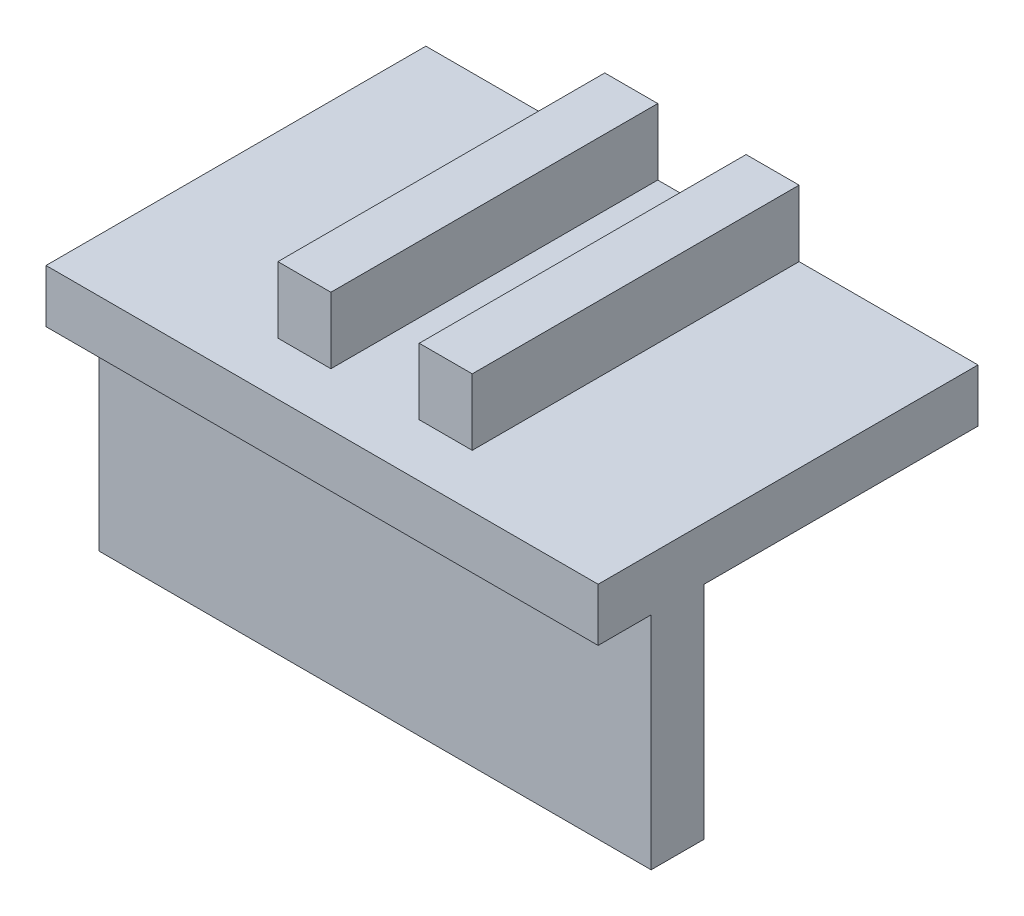
ISO-10303-21;
HEADER;
FILE_DESCRIPTION(('STEP AP214'),'2;1');
FILE_NAME('part.step','',(''),(''),'','','');
FILE_SCHEMA(('AUTOMOTIVE_DESIGN { 1 0 10303 214 1 1 1 1 }'));
ENDSEC;
DATA;
#1=APPLICATION_CONTEXT('core data for automotive mechanical design processes');
#2=APPLICATION_PROTOCOL_DEFINITION('international standard','automotive_design',2000,#1);
#3=PRODUCT_CONTEXT('',#1,'mechanical');
#4=PRODUCT('Part','Part','',(#3));
#5=PRODUCT_RELATED_PRODUCT_CATEGORY('part','',(#4));
#6=PRODUCT_DEFINITION_FORMATION('','',#4);
#7=PRODUCT_DEFINITION_CONTEXT('part definition',#1,'design');
#8=PRODUCT_DEFINITION('design','',#6,#7);
#9=PRODUCT_DEFINITION_SHAPE('','',#8);
#10=(LENGTH_UNIT() NAMED_UNIT(*) SI_UNIT(.MILLI.,.METRE.));
#11=(NAMED_UNIT(*) PLANE_ANGLE_UNIT() SI_UNIT($,.RADIAN.));
#12=(NAMED_UNIT(*) SI_UNIT($,.STERADIAN.) SOLID_ANGLE_UNIT());
#13=UNCERTAINTY_MEASURE_WITH_UNIT(LENGTH_MEASURE(1.E-05),#10,'distance_accuracy_value','');
#14=(GEOMETRIC_REPRESENTATION_CONTEXT(3) GLOBAL_UNCERTAINTY_ASSIGNED_CONTEXT((#13)) GLOBAL_UNIT_ASSIGNED_CONTEXT((#10,
#11,#12)) REPRESENTATION_CONTEXT('',''));
#15=CARTESIAN_POINT('',(0.,0.,0.));
#16=DIRECTION('',(0.,0.,1.));
#17=DIRECTION('',(1.,0.,0.));
#18=AXIS2_PLACEMENT_3D('',#15,#16,#17);
#19=CARTESIAN_POINT('',(0.,0.,12.));
#20=DIRECTION('',(0.,0.,-1.));
#21=DIRECTION('',(-1.,0.,0.));
#22=AXIS2_PLACEMENT_3D('',#19,#20,#21);
#23=PLANE('',#22);
#24=DIRECTION('',(-1.,0.,0.));
#25=VECTOR('',#24,1.);
#26=CARTESIAN_POINT('',(125.,62.,12.));
#27=LINE('',#26,#25);
#28=CARTESIAN_POINT('',(84.5,62.,12.));
#29=VERTEX_POINT('',#28);
#30=CARTESIAN_POINT('',(72.5,62.,12.));
#31=VERTEX_POINT('',#30);
#32=EDGE_CURVE('E11',#29,#31,#27,.T.);
#33=ORIENTED_EDGE('',*,*,#32,.F.);
#34=DIRECTION('',(0.,-1.,0.));
#35=VECTOR('',#34,1.);
#36=CARTESIAN_POINT('',(84.5,77.,12.));
#37=LINE('',#36,#35);
#38=CARTESIAN_POINT('',(84.5,77.,12.));
#39=VERTEX_POINT('',#38);
#40=EDGE_CURVE('E182',#39,#29,#37,.T.);
#41=ORIENTED_EDGE('',*,*,#40,.F.);
#42=DIRECTION('',(1.,0.,0.));
#43=VECTOR('',#42,1.);
#44=CARTESIAN_POINT('',(72.5,77.,12.));
#45=LINE('',#44,#43);
#46=CARTESIAN_POINT('',(72.5,77.,12.));
#47=VERTEX_POINT('',#46);
#48=EDGE_CURVE('E204',#47,#39,#45,.T.);
#49=ORIENTED_EDGE('',*,*,#48,.F.);
#50=DIRECTION('',(0.,-1.,0.));
#51=VECTOR('',#50,1.);
#52=CARTESIAN_POINT('',(72.5,77.,12.));
#53=LINE('',#52,#51);
#54=EDGE_CURVE('E57',#47,#31,#53,.T.);
#55=ORIENTED_EDGE('',*,*,#54,.T.);
#56=EDGE_LOOP('',(#33,#41,#49,#55));
#57=FACE_BOUND('',#56,.T.);
#58=ADVANCED_FACE('F32',(#57),#23,.F.);
#59=CARTESIAN_POINT('',(52.5,62.,12.));
#60=VERTEX_POINT('',#59);
#61=CARTESIAN_POINT('',(40.5,62.,12.));
#62=VERTEX_POINT('',#61);
#63=EDGE_CURVE('E41',#60,#62,#27,.T.);
#64=ORIENTED_EDGE('',*,*,#63,.F.);
#65=DIRECTION('',(0.,-1.,0.));
#66=VECTOR('',#65,1.);
#67=CARTESIAN_POINT('',(52.5,77.,12.));
#68=LINE('',#67,#66);
#69=CARTESIAN_POINT('',(52.5,77.,12.));
#70=VERTEX_POINT('',#69);
#71=EDGE_CURVE('E229',#70,#60,#68,.T.);
#72=ORIENTED_EDGE('',*,*,#71,.F.);
#73=DIRECTION('',(1.,0.,0.));
#74=VECTOR('',#73,1.);
#75=CARTESIAN_POINT('',(40.5,77.,12.));
#76=LINE('',#75,#74);
#77=CARTESIAN_POINT('',(40.5,77.,12.));
#78=VERTEX_POINT('',#77);
#79=EDGE_CURVE('E211',#78,#70,#76,.T.);
#80=ORIENTED_EDGE('',*,*,#79,.F.);
#81=DIRECTION('',(0.,-1.,0.));
#82=VECTOR('',#81,1.);
#83=CARTESIAN_POINT('',(40.5,77.,12.));
#84=LINE('',#83,#82);
#85=EDGE_CURVE('E232',#78,#62,#84,.T.);
#86=ORIENTED_EDGE('',*,*,#85,.T.);
#87=EDGE_LOOP('',(#64,#72,#80,#86));
#88=FACE_BOUND('',#87,.T.);
#89=ADVANCED_FACE('F280',(#88),#23,.F.);
#90=DIRECTION('',(1.,0.,0.));
#91=VECTOR('',#90,1.);
#92=CARTESIAN_POINT('',(0.,50.,12.));
#93=LINE('',#92,#91);
#94=CARTESIAN_POINT('',(0.,50.,12.));
#95=VERTEX_POINT('',#94);
#96=CARTESIAN_POINT('',(125.,50.,12.));
#97=VERTEX_POINT('',#96);
#98=EDGE_CURVE('E49',#95,#97,#93,.T.);
#99=ORIENTED_EDGE('',*,*,#98,.F.);
#100=DIRECTION('',(0.,-1.,0.));
#101=VECTOR('',#100,1.);
#102=CARTESIAN_POINT('',(0.,0.,12.));
#103=LINE('',#102,#101);
#104=CARTESIAN_POINT('',(0.,0.,12.));
#105=VERTEX_POINT('',#104);
#106=EDGE_CURVE('E255',#95,#105,#103,.T.);
#107=ORIENTED_EDGE('',*,*,#106,.T.);
#108=DIRECTION('',(1.,0.,0.));
#109=VECTOR('',#108,1.);
#110=CARTESIAN_POINT('',(0.,0.,12.));
#111=LINE('',#110,#109);
#112=CARTESIAN_POINT('',(125.,0.,12.));
#113=VERTEX_POINT('',#112);
#114=EDGE_CURVE('E257',#105,#113,#111,.T.);
#115=ORIENTED_EDGE('',*,*,#114,.T.);
#116=DIRECTION('',(0.,1.,0.));
#117=VECTOR('',#116,1.);
#118=CARTESIAN_POINT('',(125.,0.,12.));
#119=LINE('',#118,#117);
#120=EDGE_CURVE('E158',#113,#97,#119,.T.);
#121=ORIENTED_EDGE('',*,*,#120,.T.);
#122=EDGE_LOOP('',(#99,#107,#115,#121));
#123=FACE_BOUND('',#122,.T.);
#124=ADVANCED_FACE('F307',(#123),#23,.F.);
#125=CARTESIAN_POINT('',(0.,0.,0.));
#126=DIRECTION('',(0.,0.,-1.));
#127=DIRECTION('',(-1.,0.,0.));
#128=AXIS2_PLACEMENT_3D('',#125,#126,#127);
#129=PLANE('',#128);
#130=DIRECTION('',(0.,-1.,0.));
#131=VECTOR('',#130,1.);
#132=CARTESIAN_POINT('',(0.,0.,0.));
#133=LINE('',#132,#131);
#134=CARTESIAN_POINT('',(0.,50.,0.));
#135=VERTEX_POINT('',#134);
#136=CARTESIAN_POINT('',(0.,0.,0.));
#137=VERTEX_POINT('',#136);
#138=EDGE_CURVE('E252',#135,#137,#133,.T.);
#139=ORIENTED_EDGE('',*,*,#138,.F.);
#140=DIRECTION('',(1.,0.,0.));
#141=VECTOR('',#140,1.);
#142=CARTESIAN_POINT('',(0.,50.,0.));
#143=LINE('',#142,#141);
#144=CARTESIAN_POINT('',(125.,50.,0.));
#145=VERTEX_POINT('',#144);
#146=EDGE_CURVE('E237',#135,#145,#143,.T.);
#147=ORIENTED_EDGE('',*,*,#146,.T.);
#148=DIRECTION('',(0.,1.,0.));
#149=VECTOR('',#148,1.);
#150=CARTESIAN_POINT('',(125.,0.,0.));
#151=LINE('',#150,#149);
#152=CARTESIAN_POINT('',(125.,0.,0.));
#153=VERTEX_POINT('',#152);
#154=EDGE_CURVE('E258',#153,#145,#151,.T.);
#155=ORIENTED_EDGE('',*,*,#154,.F.);
#156=DIRECTION('',(1.,0.,0.));
#157=VECTOR('',#156,1.);
#158=CARTESIAN_POINT('',(0.,0.,0.));
#159=LINE('',#158,#157);
#160=EDGE_CURVE('E262',#137,#153,#159,.T.);
#161=ORIENTED_EDGE('',*,*,#160,.F.);
#162=EDGE_LOOP('',(#139,#147,#155,#161));
#163=FACE_BOUND('',#162,.T.);
#164=ADVANCED_FACE('F314',(#163),#129,.T.);
#165=CARTESIAN_POINT('',(0.,0.,12.));
#166=DIRECTION('',(1.,0.,0.));
#167=DIRECTION('',(0.,0.,-1.));
#168=AXIS2_PLACEMENT_3D('',#165,#166,#167);
#169=PLANE('',#168);
#170=DIRECTION('',(0.,0.,-1.));
#171=VECTOR('',#170,1.);
#172=CARTESIAN_POINT('',(0.,62.,12.));
#173=LINE('',#172,#171);
#174=CARTESIAN_POINT('',(0.,62.,24.));
#175=VERTEX_POINT('',#174);
#176=CARTESIAN_POINT('',(0.,62.,-62.));
#177=VERTEX_POINT('',#176);
#178=EDGE_CURVE('E147',#175,#177,#173,.T.);
#179=ORIENTED_EDGE('',*,*,#178,.T.);
#180=DIRECTION('',(0.,1.,0.));
#181=VECTOR('',#180,1.);
#182=CARTESIAN_POINT('',(0.,50.,-62.));
#183=LINE('',#182,#181);
#184=CARTESIAN_POINT('',(0.,50.,-62.));
#185=VERTEX_POINT('',#184);
#186=EDGE_CURVE('E250',#185,#177,#183,.T.);
#187=ORIENTED_EDGE('',*,*,#186,.F.);
#188=DIRECTION('',(0.,0.,1.));
#189=VECTOR('',#188,1.);
#190=CARTESIAN_POINT('',(0.,50.,0.));
#191=LINE('',#190,#189);
#192=EDGE_CURVE('E234',#185,#135,#191,.T.);
#193=ORIENTED_EDGE('',*,*,#192,.T.);
#194=ORIENTED_EDGE('',*,*,#138,.T.);
#195=DIRECTION('',(0.,0.,-1.));
#196=VECTOR('',#195,1.);
#197=CARTESIAN_POINT('',(0.,0.,12.));
#198=LINE('',#197,#196);
#199=EDGE_CURVE('E36',#105,#137,#198,.T.);
#200=ORIENTED_EDGE('',*,*,#199,.F.);
#201=ORIENTED_EDGE('',*,*,#106,.F.);
#202=DIRECTION('',(0.,0.,-1.));
#203=VECTOR('',#202,1.);
#204=CARTESIAN_POINT('',(0.,50.,24.));
#205=LINE('',#204,#203);
#206=CARTESIAN_POINT('',(0.,50.,24.));
#207=VERTEX_POINT('',#206);
#208=EDGE_CURVE('E163',#207,#95,#205,.T.);
#209=ORIENTED_EDGE('',*,*,#208,.F.);
#210=DIRECTION('',(0.,-1.,0.));
#211=VECTOR('',#210,1.);
#212=CARTESIAN_POINT('',(0.,62.,24.));
#213=LINE('',#212,#211);
#214=EDGE_CURVE('E161',#175,#207,#213,.T.);
#215=ORIENTED_EDGE('',*,*,#214,.F.);
#216=EDGE_LOOP('',(#179,#187,#193,#194,#200,#201,#209,#215));
#217=FACE_BOUND('',#216,.T.);
#218=ADVANCED_FACE('F34',(#217),#169,.F.);
#219=CARTESIAN_POINT('',(0.,0.,12.));
#220=DIRECTION('',(0.,1.,0.));
#221=DIRECTION('',(0.,0.,1.));
#222=AXIS2_PLACEMENT_3D('',#219,#220,#221);
#223=PLANE('',#222);
#224=ORIENTED_EDGE('',*,*,#160,.T.);
#225=DIRECTION('',(0.,0.,-1.));
#226=VECTOR('',#225,1.);
#227=CARTESIAN_POINT('',(125.,0.,12.));
#228=LINE('',#227,#226);
#229=EDGE_CURVE('E266',#113,#153,#228,.T.);
#230=ORIENTED_EDGE('',*,*,#229,.F.);
#231=ORIENTED_EDGE('',*,*,#114,.F.);
#232=ORIENTED_EDGE('',*,*,#199,.T.);
#233=EDGE_LOOP('',(#224,#230,#231,#232));
#234=FACE_BOUND('',#233,.T.);
#235=ADVANCED_FACE('F323',(#234),#223,.F.);
#236=CARTESIAN_POINT('',(125.,0.,12.));
#237=DIRECTION('',(-1.,0.,0.));
#238=DIRECTION('',(0.,0.,1.));
#239=AXIS2_PLACEMENT_3D('',#236,#237,#238);
#240=PLANE('',#239);
#241=ORIENTED_EDGE('',*,*,#154,.T.);
#242=DIRECTION('',(0.,0.,-1.));
#243=VECTOR('',#242,1.);
#244=CARTESIAN_POINT('',(125.,50.,0.));
#245=LINE('',#244,#243);
#246=CARTESIAN_POINT('',(125.,50.,-62.));
#247=VERTEX_POINT('',#246);
#248=EDGE_CURVE('E241',#145,#247,#245,.T.);
#249=ORIENTED_EDGE('',*,*,#248,.T.);
#250=DIRECTION('',(0.,1.,0.));
#251=VECTOR('',#250,1.);
#252=CARTESIAN_POINT('',(125.,50.,-62.));
#253=LINE('',#252,#251);
#254=CARTESIAN_POINT('',(125.,62.,-62.));
#255=VERTEX_POINT('',#254);
#256=EDGE_CURVE('E247',#247,#255,#253,.T.);
#257=ORIENTED_EDGE('',*,*,#256,.T.);
#258=DIRECTION('',(0.,0.,-1.));
#259=VECTOR('',#258,1.);
#260=CARTESIAN_POINT('',(125.,62.,12.));
#261=LINE('',#260,#259);
#262=CARTESIAN_POINT('',(125.,62.,24.));
#263=VERTEX_POINT('',#262);
#264=EDGE_CURVE('E157',#263,#255,#261,.T.);
#265=ORIENTED_EDGE('',*,*,#264,.F.);
#266=DIRECTION('',(0.,1.,0.));
#267=VECTOR('',#266,1.);
#268=CARTESIAN_POINT('',(125.,50.,24.));
#269=LINE('',#268,#267);
#270=CARTESIAN_POINT('',(125.,50.,24.));
#271=VERTEX_POINT('',#270);
#272=EDGE_CURVE('E171',#271,#263,#269,.T.);
#273=ORIENTED_EDGE('',*,*,#272,.F.);
#274=DIRECTION('',(0.,0.,-1.));
#275=VECTOR('',#274,1.);
#276=CARTESIAN_POINT('',(125.,50.,24.));
#277=LINE('',#276,#275);
#278=EDGE_CURVE('E176',#271,#97,#277,.T.);
#279=ORIENTED_EDGE('',*,*,#278,.T.);
#280=ORIENTED_EDGE('',*,*,#120,.F.);
#281=ORIENTED_EDGE('',*,*,#229,.T.);
#282=EDGE_LOOP('',(#241,#249,#257,#265,#273,#279,#280,#281));
#283=FACE_BOUND('',#282,.T.);
#284=ADVANCED_FACE('F328',(#283),#240,.F.);
#285=CARTESIAN_POINT('',(0.,62.,12.));
#286=DIRECTION('',(0.,-1.,0.));
#287=DIRECTION('',(0.,0.,-1.));
#288=AXIS2_PLACEMENT_3D('',#285,#286,#287);
#289=PLANE('',#288);
#290=DIRECTION('',(-1.,0.,0.));
#291=VECTOR('',#290,1.);
#292=CARTESIAN_POINT('',(0.,62.,-62.));
#293=LINE('',#292,#291);
#294=CARTESIAN_POINT('',(84.5,62.,-62.));
#295=VERTEX_POINT('',#294);
#296=EDGE_CURVE('E238',#255,#295,#293,.T.);
#297=ORIENTED_EDGE('',*,*,#296,.T.);
#298=DIRECTION('',(0.,0.,1.));
#299=VECTOR('',#298,1.);
#300=CARTESIAN_POINT('',(84.5,62.,-62.));
#301=LINE('',#300,#299);
#302=EDGE_CURVE('E192',#295,#29,#301,.T.);
#303=ORIENTED_EDGE('',*,*,#302,.T.);
#304=ORIENTED_EDGE('',*,*,#32,.T.);
#305=DIRECTION('',(0.,0.,1.));
#306=VECTOR('',#305,1.);
#307=CARTESIAN_POINT('',(72.5,62.,-62.));
#308=LINE('',#307,#306);
#309=CARTESIAN_POINT('',(72.5,62.,-62.));
#310=VERTEX_POINT('',#309);
#311=EDGE_CURVE('E195',#310,#31,#308,.T.);
#312=ORIENTED_EDGE('',*,*,#311,.F.);
#313=CARTESIAN_POINT('',(52.5,62.,-62.));
#314=VERTEX_POINT('',#313);
#315=EDGE_CURVE('E249',#310,#314,#293,.T.);
#316=ORIENTED_EDGE('',*,*,#315,.T.);
#317=DIRECTION('',(0.,0.,1.));
#318=VECTOR('',#317,1.);
#319=CARTESIAN_POINT('',(52.5,62.,-62.));
#320=LINE('',#319,#318);
#321=EDGE_CURVE('E212',#314,#60,#320,.T.);
#322=ORIENTED_EDGE('',*,*,#321,.T.);
#323=ORIENTED_EDGE('',*,*,#63,.T.);
#324=DIRECTION('',(0.,0.,1.));
#325=VECTOR('',#324,1.);
#326=CARTESIAN_POINT('',(40.5,62.,-62.));
#327=LINE('',#326,#325);
#328=CARTESIAN_POINT('',(40.5,62.,-62.));
#329=VERTEX_POINT('',#328);
#330=EDGE_CURVE('E198',#329,#62,#327,.T.);
#331=ORIENTED_EDGE('',*,*,#330,.F.);
#332=EDGE_CURVE('E154',#329,#177,#293,.T.);
#333=ORIENTED_EDGE('',*,*,#332,.T.);
#334=ORIENTED_EDGE('',*,*,#178,.F.);
#335=DIRECTION('',(-1.,0.,0.));
#336=VECTOR('',#335,1.);
#337=CARTESIAN_POINT('',(125.,62.,24.));
#338=LINE('',#337,#336);
#339=EDGE_CURVE('E151',#263,#175,#338,.T.);
#340=ORIENTED_EDGE('',*,*,#339,.F.);
#341=ORIENTED_EDGE('',*,*,#264,.T.);
#342=EDGE_LOOP('',(#297,#303,#304,#312,#316,#322,#323,#331,#333,#334,#340,#341));
#343=FACE_BOUND('',#342,.T.);
#344=ADVANCED_FACE('F149',(#343),#289,.F.);
#345=CARTESIAN_POINT('',(0.,50.,-62.));
#346=DIRECTION('',(0.,0.,-1.));
#347=DIRECTION('',(-1.,0.,0.));
#348=AXIS2_PLACEMENT_3D('',#345,#346,#347);
#349=PLANE('',#348);
#350=ORIENTED_EDGE('',*,*,#296,.F.);
#351=ORIENTED_EDGE('',*,*,#256,.F.);
#352=DIRECTION('',(-1.,0.,0.));
#353=VECTOR('',#352,1.);
#354=CARTESIAN_POINT('',(0.,50.,-62.));
#355=LINE('',#354,#353);
#356=EDGE_CURVE('E244',#247,#185,#355,.T.);
#357=ORIENTED_EDGE('',*,*,#356,.T.);
#358=ORIENTED_EDGE('',*,*,#186,.T.);
#359=ORIENTED_EDGE('',*,*,#332,.F.);
#360=DIRECTION('',(0.,-1.,0.));
#361=VECTOR('',#360,1.);
#362=CARTESIAN_POINT('',(40.5,77.,-62.));
#363=LINE('',#362,#361);
#364=CARTESIAN_POINT('',(40.5,77.,-62.));
#365=VERTEX_POINT('',#364);
#366=EDGE_CURVE('E220',#365,#329,#363,.T.);
#367=ORIENTED_EDGE('',*,*,#366,.F.);
#368=DIRECTION('',(1.,0.,0.));
#369=VECTOR('',#368,1.);
#370=CARTESIAN_POINT('',(40.5,77.,-62.));
#371=LINE('',#370,#369);
#372=CARTESIAN_POINT('',(52.5,77.,-62.));
#373=VERTEX_POINT('',#372);
#374=EDGE_CURVE('E217',#365,#373,#371,.T.);
#375=ORIENTED_EDGE('',*,*,#374,.T.);
#376=DIRECTION('',(0.,-1.,0.));
#377=VECTOR('',#376,1.);
#378=CARTESIAN_POINT('',(52.5,77.,-62.));
#379=LINE('',#378,#377);
#380=EDGE_CURVE('E226',#373,#314,#379,.T.);
#381=ORIENTED_EDGE('',*,*,#380,.T.);
#382=ORIENTED_EDGE('',*,*,#315,.F.);
#383=DIRECTION('',(0.,-1.,0.));
#384=VECTOR('',#383,1.);
#385=CARTESIAN_POINT('',(72.5,77.,-62.));
#386=LINE('',#385,#384);
#387=CARTESIAN_POINT('',(72.5,77.,-62.));
#388=VERTEX_POINT('',#387);
#389=EDGE_CURVE('E188',#388,#310,#386,.T.);
#390=ORIENTED_EDGE('',*,*,#389,.F.);
#391=DIRECTION('',(1.,0.,0.));
#392=VECTOR('',#391,1.);
#393=CARTESIAN_POINT('',(72.5,77.,-62.));
#394=LINE('',#393,#392);
#395=CARTESIAN_POINT('',(84.5,77.,-62.));
#396=VERTEX_POINT('',#395);
#397=EDGE_CURVE('E191',#388,#396,#394,.T.);
#398=ORIENTED_EDGE('',*,*,#397,.T.);
#399=DIRECTION('',(0.,-1.,0.));
#400=VECTOR('',#399,1.);
#401=CARTESIAN_POINT('',(84.5,77.,-62.));
#402=LINE('',#401,#400);
#403=EDGE_CURVE('E185',#396,#295,#402,.T.);
#404=ORIENTED_EDGE('',*,*,#403,.T.);
#405=EDGE_LOOP('',(#350,#351,#357,#358,#359,#367,#375,#381,#382,#390,#398,#404));
#406=FACE_BOUND('',#405,.T.);
#407=ADVANCED_FACE('F290',(#406),#349,.T.);
#408=CARTESIAN_POINT('',(0.,50.,0.));
#409=DIRECTION('',(0.,-1.,0.));
#410=DIRECTION('',(0.,0.,-1.));
#411=AXIS2_PLACEMENT_3D('',#408,#409,#410);
#412=PLANE('',#411);
#413=ORIENTED_EDGE('',*,*,#192,.F.);
#414=ORIENTED_EDGE('',*,*,#356,.F.);
#415=ORIENTED_EDGE('',*,*,#248,.F.);
#416=ORIENTED_EDGE('',*,*,#146,.F.);
#417=EDGE_LOOP('',(#413,#414,#415,#416));
#418=FACE_BOUND('',#417,.T.);
#419=ADVANCED_FACE('F295',(#418),#412,.T.);
#420=CARTESIAN_POINT('',(40.5,77.,-62.));
#421=DIRECTION('',(1.,0.,0.));
#422=DIRECTION('',(0.,0.,-1.));
#423=AXIS2_PLACEMENT_3D('',#420,#421,#422);
#424=PLANE('',#423);
#425=ORIENTED_EDGE('',*,*,#330,.T.);
#426=ORIENTED_EDGE('',*,*,#85,.F.);
#427=DIRECTION('',(0.,0.,1.));
#428=VECTOR('',#427,1.);
#429=CARTESIAN_POINT('',(40.5,77.,-62.));
#430=LINE('',#429,#428);
#431=EDGE_CURVE('E208',#365,#78,#430,.T.);
#432=ORIENTED_EDGE('',*,*,#431,.F.);
#433=ORIENTED_EDGE('',*,*,#366,.T.);
#434=EDGE_LOOP('',(#425,#426,#432,#433));
#435=FACE_BOUND('',#434,.T.);
#436=ADVANCED_FACE('F293',(#435),#424,.F.);
#437=CARTESIAN_POINT('',(52.5,77.,-62.));
#438=DIRECTION('',(1.,0.,0.));
#439=DIRECTION('',(0.,0.,-1.));
#440=AXIS2_PLACEMENT_3D('',#437,#438,#439);
#441=PLANE('',#440);
#442=ORIENTED_EDGE('',*,*,#321,.F.);
#443=ORIENTED_EDGE('',*,*,#380,.F.);
#444=DIRECTION('',(0.,0.,1.));
#445=VECTOR('',#444,1.);
#446=CARTESIAN_POINT('',(52.5,77.,-62.));
#447=LINE('',#446,#445);
#448=EDGE_CURVE('E214',#373,#70,#447,.T.);
#449=ORIENTED_EDGE('',*,*,#448,.T.);
#450=ORIENTED_EDGE('',*,*,#71,.T.);
#451=EDGE_LOOP('',(#442,#443,#449,#450));
#452=FACE_BOUND('',#451,.T.);
#453=ADVANCED_FACE('F283',(#452),#441,.T.);
#454=CARTESIAN_POINT('',(0.,77.,0.));
#455=DIRECTION('',(0.,1.,0.));
#456=DIRECTION('',(0.,0.,1.));
#457=AXIS2_PLACEMENT_3D('',#454,#455,#456);
#458=PLANE('',#457);
#459=ORIENTED_EDGE('',*,*,#431,.T.);
#460=ORIENTED_EDGE('',*,*,#79,.T.);
#461=ORIENTED_EDGE('',*,*,#448,.F.);
#462=ORIENTED_EDGE('',*,*,#374,.F.);
#463=EDGE_LOOP('',(#459,#460,#461,#462));
#464=FACE_BOUND('',#463,.T.);
#465=ADVANCED_FACE('F287',(#464),#458,.T.);
#466=CARTESIAN_POINT('',(72.5,77.,-62.));
#467=DIRECTION('',(1.,0.,0.));
#468=DIRECTION('',(0.,0.,-1.));
#469=AXIS2_PLACEMENT_3D('',#466,#467,#468);
#470=PLANE('',#469);
#471=ORIENTED_EDGE('',*,*,#311,.T.);
#472=ORIENTED_EDGE('',*,*,#54,.F.);
#473=DIRECTION('',(0.,0.,1.));
#474=VECTOR('',#473,1.);
#475=CARTESIAN_POINT('',(72.5,77.,-62.));
#476=LINE('',#475,#474);
#477=EDGE_CURVE('E196',#388,#47,#476,.T.);
#478=ORIENTED_EDGE('',*,*,#477,.F.);
#479=ORIENTED_EDGE('',*,*,#389,.T.);
#480=EDGE_LOOP('',(#471,#472,#478,#479));
#481=FACE_BOUND('',#480,.T.);
#482=ADVANCED_FACE('F351',(#481),#470,.F.);
#483=CARTESIAN_POINT('',(84.5,77.,-62.));
#484=DIRECTION('',(1.,0.,0.));
#485=DIRECTION('',(0.,0.,-1.));
#486=AXIS2_PLACEMENT_3D('',#483,#484,#485);
#487=PLANE('',#486);
#488=ORIENTED_EDGE('',*,*,#302,.F.);
#489=ORIENTED_EDGE('',*,*,#403,.F.);
#490=DIRECTION('',(0.,0.,1.));
#491=VECTOR('',#490,1.);
#492=CARTESIAN_POINT('',(84.5,77.,-62.));
#493=LINE('',#492,#491);
#494=EDGE_CURVE('E201',#396,#39,#493,.T.);
#495=ORIENTED_EDGE('',*,*,#494,.T.);
#496=ORIENTED_EDGE('',*,*,#40,.T.);
#497=EDGE_LOOP('',(#488,#489,#495,#496));
#498=FACE_BOUND('',#497,.T.);
#499=ADVANCED_FACE('F347',(#498),#487,.T.);
#500=CARTESIAN_POINT('',(0.,77.,0.));
#501=DIRECTION('',(0.,1.,0.));
#502=DIRECTION('',(0.,0.,1.));
#503=AXIS2_PLACEMENT_3D('',#500,#501,#502);
#504=PLANE('',#503);
#505=ORIENTED_EDGE('',*,*,#477,.T.);
#506=ORIENTED_EDGE('',*,*,#48,.T.);
#507=ORIENTED_EDGE('',*,*,#494,.F.);
#508=ORIENTED_EDGE('',*,*,#397,.F.);
#509=EDGE_LOOP('',(#505,#506,#507,#508));
#510=FACE_BOUND('',#509,.T.);
#511=ADVANCED_FACE('F340',(#510),#504,.T.);
#512=CARTESIAN_POINT('',(0.,50.,24.));
#513=DIRECTION('',(0.,1.,0.));
#514=DIRECTION('',(0.,0.,1.));
#515=AXIS2_PLACEMENT_3D('',#512,#513,#514);
#516=PLANE('',#515);
#517=ORIENTED_EDGE('',*,*,#98,.T.);
#518=ORIENTED_EDGE('',*,*,#278,.F.);
#519=DIRECTION('',(1.,0.,0.));
#520=VECTOR('',#519,1.);
#521=CARTESIAN_POINT('',(0.,50.,24.));
#522=LINE('',#521,#520);
#523=EDGE_CURVE('E166',#207,#271,#522,.T.);
#524=ORIENTED_EDGE('',*,*,#523,.F.);
#525=ORIENTED_EDGE('',*,*,#208,.T.);
#526=EDGE_LOOP('',(#517,#518,#524,#525));
#527=FACE_BOUND('',#526,.T.);
#528=ADVANCED_FACE('F338',(#527),#516,.F.);
#529=CARTESIAN_POINT('',(0.,0.,24.));
#530=DIRECTION('',(0.,0.,1.));
#531=DIRECTION('',(1.,0.,0.));
#532=AXIS2_PLACEMENT_3D('',#529,#530,#531);
#533=PLANE('',#532);
#534=ORIENTED_EDGE('',*,*,#339,.T.);
#535=ORIENTED_EDGE('',*,*,#214,.T.);
#536=ORIENTED_EDGE('',*,*,#523,.T.);
#537=ORIENTED_EDGE('',*,*,#272,.T.);
#538=EDGE_LOOP('',(#534,#535,#536,#537));
#539=FACE_BOUND('',#538,.T.);
#540=ADVANCED_FACE('F169',(#539),#533,.T.);
#541=CLOSED_SHELL('',(#58,#89,#124,#164,#218,#235,#284,#344,#407,#419,#436,#453,#465,#482,#499,
#511,#528,#540));
#542=MANIFOLD_SOLID_BREP('B2',#541);
#543=ADVANCED_BREP_SHAPE_REPRESENTATION('',(#18,#542),#14);
#544=SHAPE_DEFINITION_REPRESENTATION(#9,#543);
ENDSEC;
END-ISO-10303-21;
